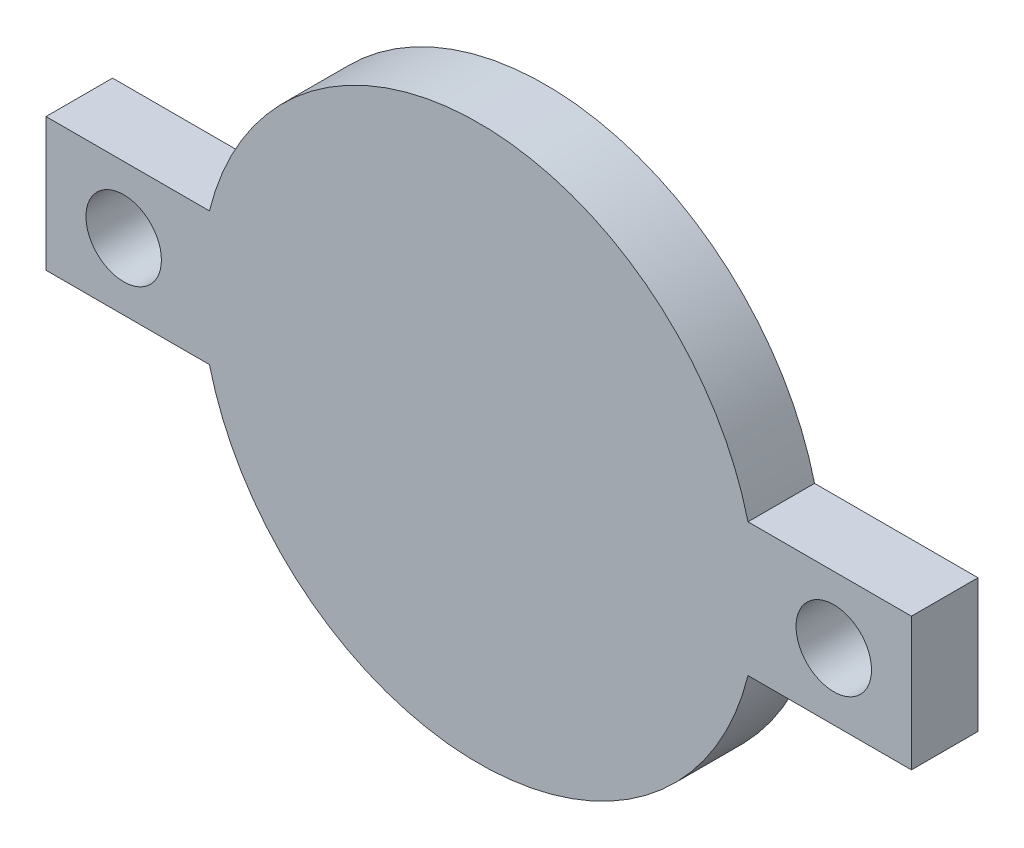
ISO-10303-21;
HEADER;
FILE_DESCRIPTION(('STEP AP214'),'2;1');
FILE_NAME('part.step','',(''),(''),'','','');
FILE_SCHEMA(('AUTOMOTIVE_DESIGN { 1 0 10303 214 1 1 1 1 }'));
ENDSEC;
DATA;
#1=APPLICATION_CONTEXT('core data for automotive mechanical design processes');
#2=APPLICATION_PROTOCOL_DEFINITION('international standard','automotive_design',2000,#1);
#3=PRODUCT_CONTEXT('',#1,'mechanical');
#4=PRODUCT('Part','Part','',(#3));
#5=PRODUCT_RELATED_PRODUCT_CATEGORY('part','',(#4));
#6=PRODUCT_DEFINITION_FORMATION('','',#4);
#7=PRODUCT_DEFINITION_CONTEXT('part definition',#1,'design');
#8=PRODUCT_DEFINITION('design','',#6,#7);
#9=PRODUCT_DEFINITION_SHAPE('','',#8);
#10=(LENGTH_UNIT() NAMED_UNIT(*) SI_UNIT(.MILLI.,.METRE.));
#11=(NAMED_UNIT(*) PLANE_ANGLE_UNIT() SI_UNIT($,.RADIAN.));
#12=(NAMED_UNIT(*) SI_UNIT($,.STERADIAN.) SOLID_ANGLE_UNIT());
#13=UNCERTAINTY_MEASURE_WITH_UNIT(LENGTH_MEASURE(1.E-05),#10,'distance_accuracy_value','');
#14=(GEOMETRIC_REPRESENTATION_CONTEXT(3) GLOBAL_UNCERTAINTY_ASSIGNED_CONTEXT((#13)) GLOBAL_UNIT_ASSIGNED_CONTEXT((#10,
#11,#12)) REPRESENTATION_CONTEXT('',''));
#15=CARTESIAN_POINT('',(0.,0.,0.));
#16=DIRECTION('',(0.,0.,1.));
#17=DIRECTION('',(1.,0.,0.));
#18=AXIS2_PLACEMENT_3D('',#15,#16,#17);
#19=CARTESIAN_POINT('',(-30.,0.,3.));
#20=DIRECTION('',(0.,0.,-1.));
#21=DIRECTION('',(-1.,0.,0.));
#22=AXIS2_PLACEMENT_3D('',#19,#20,#21);
#23=CYLINDRICAL_SURFACE('',#22,12.5);
#24=CARTESIAN_POINT('',(-30.,0.,0.));
#25=DIRECTION('',(0.,0.,1.));
#26=DIRECTION('',(1.,0.,0.));
#27=AXIS2_PLACEMENT_3D('',#24,#25,#26);
#28=CIRCLE('',#27,12.5);
#29=CARTESIAN_POINT('',(-17.8653389004884,3.00000000000001,0.));
#30=VERTEX_POINT('',#29);
#31=CARTESIAN_POINT('',(-42.1346610995116,3.,0.));
#32=VERTEX_POINT('',#31);
#33=EDGE_CURVE('E140',#30,#32,#28,.T.);
#34=ORIENTED_EDGE('',*,*,#33,.T.);
#35=DIRECTION('',(0.,0.,-1.));
#36=VECTOR('',#35,1.);
#37=CARTESIAN_POINT('',(-42.1346610995116,3.,3.));
#38=LINE('',#37,#36);
#39=CARTESIAN_POINT('',(-42.1346610995116,3.,3.));
#40=VERTEX_POINT('',#39);
#41=EDGE_CURVE('E11',#40,#32,#38,.T.);
#42=ORIENTED_EDGE('',*,*,#41,.F.);
#43=CARTESIAN_POINT('',(-30.,0.,3.));
#44=DIRECTION('',(0.,0.,1.));
#45=DIRECTION('',(1.,0.,0.));
#46=AXIS2_PLACEMENT_3D('',#43,#44,#45);
#47=CIRCLE('',#46,12.5);
#48=CARTESIAN_POINT('',(-17.8653389004884,3.00000000000001,3.));
#49=VERTEX_POINT('',#48);
#50=EDGE_CURVE('E160',#49,#40,#47,.T.);
#51=ORIENTED_EDGE('',*,*,#50,.F.);
#52=DIRECTION('',(0.,0.,-1.));
#53=VECTOR('',#52,1.);
#54=CARTESIAN_POINT('',(-17.8653389004884,3.00000000000001,3.));
#55=LINE('',#54,#53);
#56=EDGE_CURVE('E139',#49,#30,#55,.T.);
#57=ORIENTED_EDGE('',*,*,#56,.T.);
#58=EDGE_LOOP('',(#34,#42,#51,#57));
#59=FACE_BOUND('',#58,.T.);
#60=ADVANCED_FACE('F36',(#59),#23,.T.);
#61=CARTESIAN_POINT('',(0.,3.00000000000001,3.));
#62=DIRECTION('',(0.,-1.,0.));
#63=DIRECTION('',(1.,0.,0.));
#64=AXIS2_PLACEMENT_3D('',#61,#62,#63);
#65=PLANE('',#64);
#66=DIRECTION('',(-1.,0.,0.));
#67=VECTOR('',#66,1.);
#68=CARTESIAN_POINT('',(0.,3.00000000000001,0.));
#69=LINE('',#68,#67);
#70=CARTESIAN_POINT('',(-49.5,3.00000000000001,0.));
#71=VERTEX_POINT('',#70);
#72=EDGE_CURVE('E143',#32,#71,#69,.T.);
#73=ORIENTED_EDGE('',*,*,#72,.T.);
#74=DIRECTION('',(0.,0.,-1.));
#75=VECTOR('',#74,1.);
#76=CARTESIAN_POINT('',(-49.5,3.00000000000001,3.));
#77=LINE('',#76,#75);
#78=CARTESIAN_POINT('',(-49.5,3.00000000000001,3.));
#79=VERTEX_POINT('',#78);
#80=EDGE_CURVE('E45',#79,#71,#77,.T.);
#81=ORIENTED_EDGE('',*,*,#80,.F.);
#82=DIRECTION('',(-1.,0.,0.));
#83=VECTOR('',#82,1.);
#84=CARTESIAN_POINT('',(0.,3.00000000000001,3.));
#85=LINE('',#84,#83);
#86=EDGE_CURVE('E96',#40,#79,#85,.T.);
#87=ORIENTED_EDGE('',*,*,#86,.F.);
#88=ORIENTED_EDGE('',*,*,#41,.T.);
#89=EDGE_LOOP('',(#73,#81,#87,#88));
#90=FACE_BOUND('',#89,.T.);
#91=ADVANCED_FACE('F38',(#90),#65,.F.);
#92=CARTESIAN_POINT('',(-49.5,0.,3.));
#93=DIRECTION('',(1.,0.,0.));
#94=DIRECTION('',(0.,0.,-1.));
#95=AXIS2_PLACEMENT_3D('',#92,#93,#94);
#96=PLANE('',#95);
#97=DIRECTION('',(0.,-1.,0.));
#98=VECTOR('',#97,1.);
#99=CARTESIAN_POINT('',(-49.5,0.,0.));
#100=LINE('',#99,#98);
#101=CARTESIAN_POINT('',(-49.5,-2.99999999999999,0.));
#102=VERTEX_POINT('',#101);
#103=EDGE_CURVE('E147',#71,#102,#100,.T.);
#104=ORIENTED_EDGE('',*,*,#103,.T.);
#105=DIRECTION('',(0.,0.,-1.));
#106=VECTOR('',#105,1.);
#107=CARTESIAN_POINT('',(-49.5,-2.99999999999999,3.));
#108=LINE('',#107,#106);
#109=CARTESIAN_POINT('',(-49.5,-2.99999999999999,3.));
#110=VERTEX_POINT('',#109);
#111=EDGE_CURVE('E167',#110,#102,#108,.T.);
#112=ORIENTED_EDGE('',*,*,#111,.F.);
#113=DIRECTION('',(0.,-1.,0.));
#114=VECTOR('',#113,1.);
#115=CARTESIAN_POINT('',(-49.5,0.,3.));
#116=LINE('',#115,#114);
#117=EDGE_CURVE('E175',#79,#110,#116,.T.);
#118=ORIENTED_EDGE('',*,*,#117,.F.);
#119=ORIENTED_EDGE('',*,*,#80,.T.);
#120=EDGE_LOOP('',(#104,#112,#118,#119));
#121=FACE_BOUND('',#120,.T.);
#122=ADVANCED_FACE('F173',(#121),#96,.F.);
#123=CARTESIAN_POINT('',(0.,-3.00000000000003,3.));
#124=DIRECTION('',(0.,1.,0.));
#125=DIRECTION('',(-1.,0.,0.));
#126=AXIS2_PLACEMENT_3D('',#123,#124,#125);
#127=PLANE('',#126);
#128=DIRECTION('',(1.,0.,0.));
#129=VECTOR('',#128,1.);
#130=CARTESIAN_POINT('',(0.,-3.00000000000003,0.));
#131=LINE('',#130,#129);
#132=CARTESIAN_POINT('',(-42.1346610995116,-2.99999999999999,0.));
#133=VERTEX_POINT('',#132);
#134=EDGE_CURVE('E149',#102,#133,#131,.T.);
#135=ORIENTED_EDGE('',*,*,#134,.T.);
#136=DIRECTION('',(0.,0.,-1.));
#137=VECTOR('',#136,1.);
#138=CARTESIAN_POINT('',(-42.1346610995116,-2.99999999999999,3.));
#139=LINE('',#138,#137);
#140=CARTESIAN_POINT('',(-42.1346610995116,-2.99999999999999,3.));
#141=VERTEX_POINT('',#140);
#142=EDGE_CURVE('E164',#141,#133,#139,.T.);
#143=ORIENTED_EDGE('',*,*,#142,.F.);
#144=DIRECTION('',(1.,0.,0.));
#145=VECTOR('',#144,1.);
#146=CARTESIAN_POINT('',(0.,-3.00000000000003,3.));
#147=LINE('',#146,#145);
#148=EDGE_CURVE('E188',#110,#141,#147,.T.);
#149=ORIENTED_EDGE('',*,*,#148,.F.);
#150=ORIENTED_EDGE('',*,*,#111,.T.);
#151=EDGE_LOOP('',(#135,#143,#149,#150));
#152=FACE_BOUND('',#151,.T.);
#153=ADVANCED_FACE('F184',(#152),#127,.F.);
#154=CARTESIAN_POINT('',(-17.8653389004883,-2.99999999999999,0.));
#155=VERTEX_POINT('',#154);
#156=EDGE_CURVE('E145',#133,#155,#28,.T.);
#157=ORIENTED_EDGE('',*,*,#156,.T.);
#158=DIRECTION('',(0.,0.,-1.));
#159=VECTOR('',#158,1.);
#160=CARTESIAN_POINT('',(-17.8653389004883,-2.99999999999999,3.));
#161=LINE('',#160,#159);
#162=CARTESIAN_POINT('',(-17.8653389004883,-2.99999999999999,3.));
#163=VERTEX_POINT('',#162);
#164=EDGE_CURVE('E125',#163,#155,#161,.T.);
#165=ORIENTED_EDGE('',*,*,#164,.F.);
#166=EDGE_CURVE('E116',#141,#163,#47,.T.);
#167=ORIENTED_EDGE('',*,*,#166,.F.);
#168=ORIENTED_EDGE('',*,*,#142,.T.);
#169=EDGE_LOOP('',(#157,#165,#167,#168));
#170=FACE_BOUND('',#169,.T.);
#171=ADVANCED_FACE('F187',(#170),#23,.T.);
#172=CARTESIAN_POINT('',(0.,-2.99999999999999,3.));
#173=DIRECTION('',(0.,1.,0.));
#174=DIRECTION('',(-1.,0.,0.));
#175=AXIS2_PLACEMENT_3D('',#172,#173,#174);
#176=PLANE('',#175);
#177=DIRECTION('',(1.,0.,0.));
#178=VECTOR('',#177,1.);
#179=CARTESIAN_POINT('',(0.,-2.99999999999999,0.));
#180=LINE('',#179,#178);
#181=CARTESIAN_POINT('',(-10.4999999999999,-2.99999999999999,0.));
#182=VERTEX_POINT('',#181);
#183=EDGE_CURVE('E124',#155,#182,#180,.T.);
#184=ORIENTED_EDGE('',*,*,#183,.T.);
#185=DIRECTION('',(0.,0.,-1.));
#186=VECTOR('',#185,1.);
#187=CARTESIAN_POINT('',(-10.4999999999999,-2.99999999999999,3.));
#188=LINE('',#187,#186);
#189=CARTESIAN_POINT('',(-10.4999999999999,-2.99999999999999,3.));
#190=VERTEX_POINT('',#189);
#191=EDGE_CURVE('E121',#190,#182,#188,.T.);
#192=ORIENTED_EDGE('',*,*,#191,.F.);
#193=DIRECTION('',(1.,0.,0.));
#194=VECTOR('',#193,1.);
#195=CARTESIAN_POINT('',(0.,-2.99999999999999,3.));
#196=LINE('',#195,#194);
#197=EDGE_CURVE('E109',#163,#190,#196,.T.);
#198=ORIENTED_EDGE('',*,*,#197,.F.);
#199=ORIENTED_EDGE('',*,*,#164,.T.);
#200=EDGE_LOOP('',(#184,#192,#198,#199));
#201=FACE_BOUND('',#200,.T.);
#202=ADVANCED_FACE('F122',(#201),#176,.F.);
#203=CARTESIAN_POINT('',(-10.4999999999999,0.,3.));
#204=DIRECTION('',(-1.,0.,0.));
#205=DIRECTION('',(0.,0.,1.));
#206=AXIS2_PLACEMENT_3D('',#203,#204,#205);
#207=PLANE('',#206);
#208=DIRECTION('',(0.,1.,0.));
#209=VECTOR('',#208,1.);
#210=CARTESIAN_POINT('',(-10.4999999999999,0.,0.));
#211=LINE('',#210,#209);
#212=CARTESIAN_POINT('',(-10.4999999999999,3.00000000000001,0.));
#213=VERTEX_POINT('',#212);
#214=EDGE_CURVE('E82',#182,#213,#211,.T.);
#215=ORIENTED_EDGE('',*,*,#214,.T.);
#216=DIRECTION('',(0.,0.,-1.));
#217=VECTOR('',#216,1.);
#218=CARTESIAN_POINT('',(-10.4999999999999,3.00000000000001,3.));
#219=LINE('',#218,#217);
#220=CARTESIAN_POINT('',(-10.4999999999999,3.00000000000001,3.));
#221=VERTEX_POINT('',#220);
#222=EDGE_CURVE('E126',#221,#213,#219,.T.);
#223=ORIENTED_EDGE('',*,*,#222,.F.);
#224=DIRECTION('',(0.,1.,0.));
#225=VECTOR('',#224,1.);
#226=CARTESIAN_POINT('',(-10.4999999999999,0.,3.));
#227=LINE('',#226,#225);
#228=EDGE_CURVE('E114',#190,#221,#227,.T.);
#229=ORIENTED_EDGE('',*,*,#228,.F.);
#230=ORIENTED_EDGE('',*,*,#191,.T.);
#231=EDGE_LOOP('',(#215,#223,#229,#230));
#232=FACE_BOUND('',#231,.T.);
#233=ADVANCED_FACE('F128',(#232),#207,.F.);
#234=CARTESIAN_POINT('',(-13.9999999999999,0.,3.));
#235=DIRECTION('',(0.,0.,-1.));
#236=DIRECTION('',(-1.,0.,0.));
#237=AXIS2_PLACEMENT_3D('',#234,#235,#236);
#238=CYLINDRICAL_SURFACE('',#237,1.7);
#239=CARTESIAN_POINT('',(-13.9999999999999,0.,3.));
#240=DIRECTION('',(0.,0.,1.));
#241=DIRECTION('',(1.,0.,0.));
#242=AXIS2_PLACEMENT_3D('',#239,#240,#241);
#243=CIRCLE('',#242,1.7);
#244=CARTESIAN_POINT('',(-12.2999999999999,0.,3.));
#245=VERTEX_POINT('',#244);
#246=EDGE_CURVE('E130',#245,#245,#243,.T.);
#247=ORIENTED_EDGE('',*,*,#246,.T.);
#248=EDGE_LOOP('',(#247));
#249=FACE_BOUND('',#248,.T.);
#250=CARTESIAN_POINT('',(-13.9999999999999,0.,0.));
#251=DIRECTION('',(0.,0.,1.));
#252=DIRECTION('',(1.,0.,0.));
#253=AXIS2_PLACEMENT_3D('',#250,#251,#252);
#254=CIRCLE('',#253,1.7);
#255=CARTESIAN_POINT('',(-12.2999999999999,0.,0.));
#256=VERTEX_POINT('',#255);
#257=EDGE_CURVE('E154',#256,#256,#254,.T.);
#258=ORIENTED_EDGE('',*,*,#257,.F.);
#259=EDGE_LOOP('',(#258));
#260=FACE_BOUND('',#259,.T.);
#261=ADVANCED_FACE('F291',(#249,#260),#238,.F.);
#262=CARTESIAN_POINT('',(0.,3.00000000000001,3.));
#263=DIRECTION('',(0.,-1.,0.));
#264=DIRECTION('',(1.,0.,0.));
#265=AXIS2_PLACEMENT_3D('',#262,#263,#264);
#266=PLANE('',#265);
#267=DIRECTION('',(-1.,0.,0.));
#268=VECTOR('',#267,1.);
#269=CARTESIAN_POINT('',(0.,3.00000000000001,0.));
#270=LINE('',#269,#268);
#271=EDGE_CURVE('E88',#213,#30,#270,.T.);
#272=ORIENTED_EDGE('',*,*,#271,.T.);
#273=ORIENTED_EDGE('',*,*,#56,.F.);
#274=DIRECTION('',(-1.,0.,0.));
#275=VECTOR('',#274,1.);
#276=CARTESIAN_POINT('',(0.,3.00000000000001,3.));
#277=LINE('',#276,#275);
#278=EDGE_CURVE('E53',#221,#49,#277,.T.);
#279=ORIENTED_EDGE('',*,*,#278,.F.);
#280=ORIENTED_EDGE('',*,*,#222,.T.);
#281=EDGE_LOOP('',(#272,#273,#279,#280));
#282=FACE_BOUND('',#281,.T.);
#283=ADVANCED_FACE('F299',(#282),#266,.F.);
#284=CARTESIAN_POINT('',(-46.,0.,3.));
#285=DIRECTION('',(0.,0.,-1.));
#286=DIRECTION('',(-1.,0.,0.));
#287=AXIS2_PLACEMENT_3D('',#284,#285,#286);
#288=CYLINDRICAL_SURFACE('',#287,1.7);
#289=CARTESIAN_POINT('',(-46.,0.,3.));
#290=DIRECTION('',(0.,0.,1.));
#291=DIRECTION('',(1.,0.,0.));
#292=AXIS2_PLACEMENT_3D('',#289,#290,#291);
#293=CIRCLE('',#292,1.7);
#294=CARTESIAN_POINT('',(-44.3,0.,3.));
#295=VERTEX_POINT('',#294);
#296=EDGE_CURVE('E136',#295,#295,#293,.F.);
#297=ORIENTED_EDGE('',*,*,#296,.F.);
#298=EDGE_LOOP('',(#297));
#299=FACE_BOUND('',#298,.T.);
#300=CARTESIAN_POINT('',(-46.,0.,0.));
#301=DIRECTION('',(0.,0.,1.));
#302=DIRECTION('',(1.,0.,0.));
#303=AXIS2_PLACEMENT_3D('',#300,#301,#302);
#304=CIRCLE('',#303,1.7);
#305=CARTESIAN_POINT('',(-44.3,0.,0.));
#306=VERTEX_POINT('',#305);
#307=EDGE_CURVE('E157',#306,#306,#304,.F.);
#308=ORIENTED_EDGE('',*,*,#307,.T.);
#309=EDGE_LOOP('',(#308));
#310=FACE_BOUND('',#309,.T.);
#311=ADVANCED_FACE('F308',(#299,#310),#288,.F.);
#312=CARTESIAN_POINT('',(0.,0.,3.));
#313=DIRECTION('',(0.,0.,1.));
#314=DIRECTION('',(1.,0.,0.));
#315=AXIS2_PLACEMENT_3D('',#312,#313,#314);
#316=PLANE('',#315);
#317=ORIENTED_EDGE('',*,*,#50,.T.);
#318=ORIENTED_EDGE('',*,*,#86,.T.);
#319=ORIENTED_EDGE('',*,*,#117,.T.);
#320=ORIENTED_EDGE('',*,*,#148,.T.);
#321=ORIENTED_EDGE('',*,*,#166,.T.);
#322=ORIENTED_EDGE('',*,*,#197,.T.);
#323=ORIENTED_EDGE('',*,*,#228,.T.);
#324=ORIENTED_EDGE('',*,*,#278,.T.);
#325=EDGE_LOOP('',(#317,#318,#319,#320,#321,#322,#323,#324));
#326=FACE_BOUND('',#325,.T.);
#327=ORIENTED_EDGE('',*,*,#246,.F.);
#328=EDGE_LOOP('',(#327));
#329=FACE_BOUND('',#328,.T.);
#330=ORIENTED_EDGE('',*,*,#296,.T.);
#331=EDGE_LOOP('',(#330));
#332=FACE_BOUND('',#331,.T.);
#333=ADVANCED_FACE('F111',(#326,#329,#332),#316,.T.);
#334=CARTESIAN_POINT('',(0.,0.,0.));
#335=DIRECTION('',(0.,0.,1.));
#336=DIRECTION('',(1.,0.,0.));
#337=AXIS2_PLACEMENT_3D('',#334,#335,#336);
#338=PLANE('',#337);
#339=CARTESIAN_POINT('',(-30.,0.,0.));
#340=DIRECTION('',(0.,0.,-1.));
#341=DIRECTION('',(-1.,0.,0.));
#342=AXIS2_PLACEMENT_3D('',#339,#340,#341);
#343=CIRCLE('',#342,10.2);
#344=CARTESIAN_POINT('',(-40.2,0.,0.));
#345=VERTEX_POINT('',#344);
#346=EDGE_CURVE('E395',#345,#345,#343,.T.);
#347=ORIENTED_EDGE('',*,*,#346,.F.);
#348=EDGE_LOOP('',(#347));
#349=FACE_BOUND('',#348,.T.);
#350=ORIENTED_EDGE('',*,*,#33,.F.);
#351=ORIENTED_EDGE('',*,*,#271,.F.);
#352=ORIENTED_EDGE('',*,*,#214,.F.);
#353=ORIENTED_EDGE('',*,*,#183,.F.);
#354=ORIENTED_EDGE('',*,*,#156,.F.);
#355=ORIENTED_EDGE('',*,*,#134,.F.);
#356=ORIENTED_EDGE('',*,*,#103,.F.);
#357=ORIENTED_EDGE('',*,*,#72,.F.);
#358=EDGE_LOOP('',(#350,#351,#352,#353,#354,#355,#356,#357));
#359=FACE_BOUND('',#358,.T.);
#360=ORIENTED_EDGE('',*,*,#257,.T.);
#361=EDGE_LOOP('',(#360));
#362=FACE_BOUND('',#361,.T.);
#363=ORIENTED_EDGE('',*,*,#307,.F.);
#364=EDGE_LOOP('',(#363));
#365=FACE_BOUND('',#364,.T.);
#366=ADVANCED_FACE('F179',(#349,#359,#362,#365),#338,.F.);
#367=CARTESIAN_POINT('',(-30.,0.,1.));
#368=DIRECTION('',(0.,0.,-1.));
#369=DIRECTION('',(-1.,0.,0.));
#370=AXIS2_PLACEMENT_3D('',#367,#368,#369);
#371=CYLINDRICAL_SURFACE('',#370,10.2);
#372=CARTESIAN_POINT('',(-30.,0.,1.));
#373=DIRECTION('',(0.,0.,-1.));
#374=DIRECTION('',(-1.,0.,0.));
#375=AXIS2_PLACEMENT_3D('',#372,#373,#374);
#376=CIRCLE('',#375,10.2);
#377=CARTESIAN_POINT('',(-40.2,0.,1.));
#378=VERTEX_POINT('',#377);
#379=EDGE_CURVE('E144',#378,#378,#376,.T.);
#380=ORIENTED_EDGE('',*,*,#379,.F.);
#381=EDGE_LOOP('',(#380));
#382=FACE_BOUND('',#381,.T.);
#383=ORIENTED_EDGE('',*,*,#346,.T.);
#384=EDGE_LOOP('',(#383));
#385=FACE_BOUND('',#384,.T.);
#386=ADVANCED_FACE('F349',(#382,#385),#371,.F.);
#387=CARTESIAN_POINT('',(-30.,0.,1.));
#388=DIRECTION('',(0.,0.,-1.));
#389=DIRECTION('',(-1.,0.,0.));
#390=AXIS2_PLACEMENT_3D('',#387,#388,#389);
#391=PLANE('',#390);
#392=ORIENTED_EDGE('',*,*,#379,.T.);
#393=EDGE_LOOP('',(#392));
#394=FACE_BOUND('',#393,.T.);
#395=ADVANCED_FACE('F373',(#394),#391,.T.);
#396=CLOSED_SHELL('',(#60,#91,#122,#153,#171,#202,#233,#261,#283,#311,#333,#366,#386,#395));
#397=MANIFOLD_SOLID_BREP('B2',#396);
#398=ADVANCED_BREP_SHAPE_REPRESENTATION('',(#18,#397),#14);
#399=SHAPE_DEFINITION_REPRESENTATION(#9,#398);
ENDSEC;
END-ISO-10303-21;
